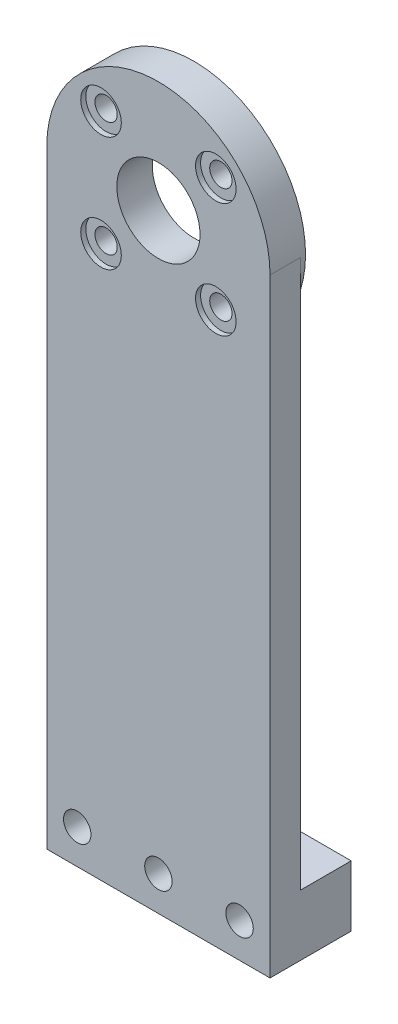
ISO-10303-21;
HEADER;
FILE_DESCRIPTION(('STEP AP214'),'2;1');
FILE_NAME('part.step','',(''),(''),'','','');
FILE_SCHEMA(('AUTOMOTIVE_DESIGN { 1 0 10303 214 1 1 1 1 }'));
ENDSEC;
DATA;
#1=APPLICATION_CONTEXT('core data for automotive mechanical design processes');
#2=APPLICATION_PROTOCOL_DEFINITION('international standard','automotive_design',2000,#1);
#3=PRODUCT_CONTEXT('',#1,'mechanical');
#4=PRODUCT('Part','Part','',(#3));
#5=PRODUCT_RELATED_PRODUCT_CATEGORY('part','',(#4));
#6=PRODUCT_DEFINITION_FORMATION('','',#4);
#7=PRODUCT_DEFINITION_CONTEXT('part definition',#1,'design');
#8=PRODUCT_DEFINITION('design','',#6,#7);
#9=PRODUCT_DEFINITION_SHAPE('','',#8);
#10=(LENGTH_UNIT() NAMED_UNIT(*) SI_UNIT(.MILLI.,.METRE.));
#11=(NAMED_UNIT(*) PLANE_ANGLE_UNIT() SI_UNIT($,.RADIAN.));
#12=(NAMED_UNIT(*) SI_UNIT($,.STERADIAN.) SOLID_ANGLE_UNIT());
#13=UNCERTAINTY_MEASURE_WITH_UNIT(LENGTH_MEASURE(1.E-05),#10,'distance_accuracy_value','');
#14=(GEOMETRIC_REPRESENTATION_CONTEXT(3) GLOBAL_UNCERTAINTY_ASSIGNED_CONTEXT((#13)) GLOBAL_UNIT_ASSIGNED_CONTEXT((#10,
#11,#12)) REPRESENTATION_CONTEXT('',''));
#15=CARTESIAN_POINT('',(0.,0.,0.));
#16=DIRECTION('',(0.,0.,1.));
#17=DIRECTION('',(1.,0.,0.));
#18=AXIS2_PLACEMENT_3D('',#15,#16,#17);
#19=CARTESIAN_POINT('',(-5.65685424949235,24.3431457505076,-12.0965512114594));
#20=DIRECTION('',(0.,0.,1.));
#21=DIRECTION('',(1.,0.,0.));
#22=AXIS2_PLACEMENT_3D('',#19,#20,#21);
#23=CYLINDRICAL_SURFACE('',#22,1.10000000000001);
#24=CARTESIAN_POINT('',(-5.65685424949235,24.3431457505076,-0.5));
#25=DIRECTION('',(0.,0.,1.));
#26=DIRECTION('',(1.,0.,0.));
#27=AXIS2_PLACEMENT_3D('',#24,#25,#26);
#28=CIRCLE('',#27,1.10000000000001);
#29=CARTESIAN_POINT('',(-4.55685424949234,24.3431457505076,-0.5));
#30=VERTEX_POINT('',#29);
#31=EDGE_CURVE('E214',#30,#30,#28,.F.);
#32=ORIENTED_EDGE('',*,*,#31,.T.);
#33=EDGE_LOOP('',(#32));
#34=FACE_BOUND('',#33,.T.);
#35=CARTESIAN_POINT('',(-5.65685424949235,24.3431457505076,2.5));
#36=DIRECTION('',(0.,0.,1.));
#37=DIRECTION('',(1.,0.,0.));
#38=AXIS2_PLACEMENT_3D('',#35,#36,#37);
#39=CIRCLE('',#38,1.10000000000001);
#40=CARTESIAN_POINT('',(-4.55685424949234,24.3431457505076,2.5));
#41=VERTEX_POINT('',#40);
#42=EDGE_CURVE('E196',#41,#41,#39,.F.);
#43=ORIENTED_EDGE('',*,*,#42,.F.);
#44=EDGE_LOOP('',(#43));
#45=FACE_BOUND('',#44,.T.);
#46=ADVANCED_FACE('F73',(#34,#45),#23,.F.);
#47=CARTESIAN_POINT('',(-5.65685424949243,35.6568542494923,-12.0965512114594));
#48=DIRECTION('',(0.,0.,1.));
#49=DIRECTION('',(1.,0.,0.));
#50=AXIS2_PLACEMENT_3D('',#47,#48,#49);
#51=CYLINDRICAL_SURFACE('',#50,1.10000000000001);
#52=CARTESIAN_POINT('',(-5.65685424949243,35.6568542494923,-0.5));
#53=DIRECTION('',(0.,0.,1.));
#54=DIRECTION('',(1.,0.,0.));
#55=AXIS2_PLACEMENT_3D('',#52,#53,#54);
#56=CIRCLE('',#55,1.10000000000001);
#57=CARTESIAN_POINT('',(-4.55685424949242,35.6568542494923,-0.5));
#58=VERTEX_POINT('',#57);
#59=EDGE_CURVE('E218',#58,#58,#56,.F.);
#60=ORIENTED_EDGE('',*,*,#59,.T.);
#61=EDGE_LOOP('',(#60));
#62=FACE_BOUND('',#61,.T.);
#63=CARTESIAN_POINT('',(-5.65685424949243,35.6568542494923,2.5));
#64=DIRECTION('',(0.,0.,1.));
#65=DIRECTION('',(1.,0.,0.));
#66=AXIS2_PLACEMENT_3D('',#63,#64,#65);
#67=CIRCLE('',#66,1.10000000000001);
#68=CARTESIAN_POINT('',(-4.55685424949242,35.6568542494923,2.5));
#69=VERTEX_POINT('',#68);
#70=EDGE_CURVE('E183',#69,#69,#67,.F.);
#71=ORIENTED_EDGE('',*,*,#70,.F.);
#72=EDGE_LOOP('',(#71));
#73=FACE_BOUND('',#72,.T.);
#74=ADVANCED_FACE('F297',(#62,#73),#51,.F.);
#75=CARTESIAN_POINT('',(5.65685424949247,24.3431457505077,-12.0965512114594));
#76=DIRECTION('',(0.,0.,1.));
#77=DIRECTION('',(1.,0.,0.));
#78=AXIS2_PLACEMENT_3D('',#75,#76,#77);
#79=CYLINDRICAL_SURFACE('',#78,1.10000000000001);
#80=CARTESIAN_POINT('',(5.65685424949247,24.3431457505077,-0.5));
#81=DIRECTION('',(0.,0.,1.));
#82=DIRECTION('',(1.,0.,0.));
#83=AXIS2_PLACEMENT_3D('',#80,#81,#82);
#84=CIRCLE('',#83,1.10000000000001);
#85=CARTESIAN_POINT('',(6.75685424949248,24.3431457505077,-0.5));
#86=VERTEX_POINT('',#85);
#87=EDGE_CURVE('E191',#86,#86,#84,.F.);
#88=ORIENTED_EDGE('',*,*,#87,.T.);
#89=EDGE_LOOP('',(#88));
#90=FACE_BOUND('',#89,.T.);
#91=CARTESIAN_POINT('',(5.65685424949247,24.3431457505077,2.5));
#92=DIRECTION('',(0.,0.,1.));
#93=DIRECTION('',(1.,0.,0.));
#94=AXIS2_PLACEMENT_3D('',#91,#92,#93);
#95=CIRCLE('',#94,1.10000000000001);
#96=CARTESIAN_POINT('',(6.75685424949248,24.3431457505077,2.5));
#97=VERTEX_POINT('',#96);
#98=EDGE_CURVE('E175',#97,#97,#95,.F.);
#99=ORIENTED_EDGE('',*,*,#98,.F.);
#100=EDGE_LOOP('',(#99));
#101=FACE_BOUND('',#100,.T.);
#102=ADVANCED_FACE('F303',(#90,#101),#79,.F.);
#103=CARTESIAN_POINT('',(5.65685424949234,35.6568542494924,-12.0965512114594));
#104=DIRECTION('',(0.,0.,1.));
#105=DIRECTION('',(1.,0.,0.));
#106=AXIS2_PLACEMENT_3D('',#103,#104,#105);
#107=CYLINDRICAL_SURFACE('',#106,1.10000000000001);
#108=CARTESIAN_POINT('',(5.65685424949234,35.6568542494924,-0.5));
#109=DIRECTION('',(0.,0.,1.));
#110=DIRECTION('',(1.,0.,0.));
#111=AXIS2_PLACEMENT_3D('',#108,#109,#110);
#112=CIRCLE('',#111,1.10000000000001);
#113=CARTESIAN_POINT('',(6.75685424949235,35.6568542494924,-0.5));
#114=VERTEX_POINT('',#113);
#115=EDGE_CURVE('E237',#114,#114,#112,.F.);
#116=ORIENTED_EDGE('',*,*,#115,.T.);
#117=EDGE_LOOP('',(#116));
#118=FACE_BOUND('',#117,.T.);
#119=CARTESIAN_POINT('',(5.65685424949234,35.6568542494924,2.5));
#120=DIRECTION('',(0.,0.,1.));
#121=DIRECTION('',(1.,0.,0.));
#122=AXIS2_PLACEMENT_3D('',#119,#120,#121);
#123=CIRCLE('',#122,1.10000000000001);
#124=CARTESIAN_POINT('',(6.75685424949235,35.6568542494924,2.5));
#125=VERTEX_POINT('',#124);
#126=EDGE_CURVE('E222',#125,#125,#123,.F.);
#127=ORIENTED_EDGE('',*,*,#126,.F.);
#128=EDGE_LOOP('',(#127));
#129=FACE_BOUND('',#128,.T.);
#130=ADVANCED_FACE('F313',(#118,#129),#107,.F.);
#131=CARTESIAN_POINT('',(11.,0.,3.));
#132=DIRECTION('',(1.,0.,0.));
#133=DIRECTION('',(0.,1.,0.));
#134=AXIS2_PLACEMENT_3D('',#131,#132,#133);
#135=PLANE('',#134);
#136=DIRECTION('',(0.,0.,-1.));
#137=VECTOR('',#136,1.);
#138=CARTESIAN_POINT('',(11.,-30.,3.));
#139=LINE('',#138,#137);
#140=CARTESIAN_POINT('',(11.,-30.,3.));
#141=VERTEX_POINT('',#140);
#142=CARTESIAN_POINT('',(11.,-30.,-5.));
#143=VERTEX_POINT('',#142);
#144=EDGE_CURVE('E134',#141,#143,#139,.T.);
#145=ORIENTED_EDGE('',*,*,#144,.T.);
#146=DIRECTION('',(0.,-1.,0.));
#147=VECTOR('',#146,1.);
#148=CARTESIAN_POINT('',(11.,0.,-5.));
#149=LINE('',#148,#147);
#150=CARTESIAN_POINT('',(11.,-24.,-5.));
#151=VERTEX_POINT('',#150);
#152=EDGE_CURVE('E136',#151,#143,#149,.T.);
#153=ORIENTED_EDGE('',*,*,#152,.F.);
#154=DIRECTION('',(0.,0.,1.));
#155=VECTOR('',#154,1.);
#156=CARTESIAN_POINT('',(11.,-24.,-5.));
#157=LINE('',#156,#155);
#158=CARTESIAN_POINT('',(11.,-24.,0.));
#159=VERTEX_POINT('',#158);
#160=EDGE_CURVE('E170',#151,#159,#157,.T.);
#161=ORIENTED_EDGE('',*,*,#160,.T.);
#162=DIRECTION('',(0.,-1.,0.));
#163=VECTOR('',#162,1.);
#164=CARTESIAN_POINT('',(11.,0.,0.));
#165=LINE('',#164,#163);
#166=CARTESIAN_POINT('',(11.,30.,0.));
#167=VERTEX_POINT('',#166);
#168=EDGE_CURVE('E263',#167,#159,#165,.T.);
#169=ORIENTED_EDGE('',*,*,#168,.F.);
#170=DIRECTION('',(0.,0.,-1.));
#171=VECTOR('',#170,1.);
#172=CARTESIAN_POINT('',(11.,30.,3.));
#173=LINE('',#172,#171);
#174=CARTESIAN_POINT('',(11.,30.,3.));
#175=VERTEX_POINT('',#174);
#176=EDGE_CURVE('E84',#175,#167,#173,.T.);
#177=ORIENTED_EDGE('',*,*,#176,.F.);
#178=DIRECTION('',(0.,-1.,0.));
#179=VECTOR('',#178,1.);
#180=CARTESIAN_POINT('',(11.,0.,3.));
#181=LINE('',#180,#179);
#182=EDGE_CURVE('E93',#175,#141,#181,.T.);
#183=ORIENTED_EDGE('',*,*,#182,.T.);
#184=EDGE_LOOP('',(#145,#153,#161,#169,#177,#183));
#185=FACE_BOUND('',#184,.T.);
#186=ADVANCED_FACE('F75',(#185),#135,.T.);
#187=CARTESIAN_POINT('',(0.,0.,0.));
#188=DIRECTION('',(0.,0.,1.));
#189=DIRECTION('',(1.,0.,0.));
#190=AXIS2_PLACEMENT_3D('',#187,#188,#189);
#191=PLANE('',#190);
#192=ORIENTED_EDGE('',*,*,#168,.T.);
#193=DIRECTION('',(-1.,0.,0.));
#194=VECTOR('',#193,1.);
#195=CARTESIAN_POINT('',(0.,-24.,0.));
#196=LINE('',#195,#194);
#197=CARTESIAN_POINT('',(-11.,-24.,0.));
#198=VERTEX_POINT('',#197);
#199=EDGE_CURVE('E157',#159,#198,#196,.T.);
#200=ORIENTED_EDGE('',*,*,#199,.T.);
#201=DIRECTION('',(0.,-1.,0.));
#202=VECTOR('',#201,1.);
#203=CARTESIAN_POINT('',(-11.,0.,0.));
#204=LINE('',#203,#202);
#205=CARTESIAN_POINT('',(-11.,30.,0.));
#206=VERTEX_POINT('',#205);
#207=EDGE_CURVE('E256',#206,#198,#204,.T.);
#208=ORIENTED_EDGE('',*,*,#207,.F.);
#209=CARTESIAN_POINT('',(0.,30.,0.));
#210=DIRECTION('',(0.,0.,1.));
#211=DIRECTION('',(1.,0.,0.));
#212=AXIS2_PLACEMENT_3D('',#209,#210,#211);
#213=CIRCLE('',#212,11.);
#214=EDGE_CURVE('E13',#206,#167,#213,.T.);
#215=ORIENTED_EDGE('',*,*,#214,.T.);
#216=EDGE_LOOP('',(#192,#200,#208,#215));
#217=FACE_BOUND('',#216,.T.);
#218=ADVANCED_FACE('F276',(#217),#191,.F.);
#219=CARTESIAN_POINT('',(0.,-30.,3.));
#220=DIRECTION('',(0.,1.,0.));
#221=DIRECTION('',(-1.,0.,0.));
#222=AXIS2_PLACEMENT_3D('',#219,#220,#221);
#223=PLANE('',#222);
#224=DIRECTION('',(0.,0.,-1.));
#225=VECTOR('',#224,1.);
#226=CARTESIAN_POINT('',(-11.,-30.,3.));
#227=LINE('',#226,#225);
#228=CARTESIAN_POINT('',(-11.,-30.,3.));
#229=VERTEX_POINT('',#228);
#230=CARTESIAN_POINT('',(-11.,-30.,-5.));
#231=VERTEX_POINT('',#230);
#232=EDGE_CURVE('E77',#229,#231,#227,.T.);
#233=ORIENTED_EDGE('',*,*,#232,.T.);
#234=DIRECTION('',(1.,0.,0.));
#235=VECTOR('',#234,1.);
#236=CARTESIAN_POINT('',(0.,-30.,-5.));
#237=LINE('',#236,#235);
#238=EDGE_CURVE('E148',#231,#143,#237,.T.);
#239=ORIENTED_EDGE('',*,*,#238,.T.);
#240=ORIENTED_EDGE('',*,*,#144,.F.);
#241=DIRECTION('',(1.,0.,0.));
#242=VECTOR('',#241,1.);
#243=CARTESIAN_POINT('',(0.,-30.,3.));
#244=LINE('',#243,#242);
#245=EDGE_CURVE('E142',#229,#141,#244,.T.);
#246=ORIENTED_EDGE('',*,*,#245,.F.);
#247=EDGE_LOOP('',(#233,#239,#240,#246));
#248=FACE_BOUND('',#247,.T.);
#249=ADVANCED_FACE('F154',(#248),#223,.F.);
#250=CARTESIAN_POINT('',(0.,0.,3.));
#251=DIRECTION('',(0.,0.,1.));
#252=DIRECTION('',(1.,0.,0.));
#253=AXIS2_PLACEMENT_3D('',#250,#251,#252);
#254=PLANE('',#253);
#255=CARTESIAN_POINT('',(8.,-26.6,3.));
#256=DIRECTION('',(0.,0.,1.));
#257=DIRECTION('',(1.,0.,0.));
#258=AXIS2_PLACEMENT_3D('',#255,#256,#257);
#259=CIRCLE('',#258,1.35);
#260=CARTESIAN_POINT('',(9.35,-26.6,3.));
#261=VERTEX_POINT('',#260);
#262=EDGE_CURVE('E496',#261,#261,#259,.T.);
#263=ORIENTED_EDGE('',*,*,#262,.F.);
#264=EDGE_LOOP('',(#263));
#265=FACE_BOUND('',#264,.T.);
#266=CARTESIAN_POINT('',(-8.,-26.6,3.));
#267=DIRECTION('',(0.,0.,1.));
#268=DIRECTION('',(1.,0.,0.));
#269=AXIS2_PLACEMENT_3D('',#266,#267,#268);
#270=CIRCLE('',#269,1.35);
#271=CARTESIAN_POINT('',(-6.65,-26.6,3.));
#272=VERTEX_POINT('',#271);
#273=EDGE_CURVE('E503',#272,#272,#270,.T.);
#274=ORIENTED_EDGE('',*,*,#273,.F.);
#275=EDGE_LOOP('',(#274));
#276=FACE_BOUND('',#275,.T.);
#277=CARTESIAN_POINT('',(0.,-26.6,3.));
#278=DIRECTION('',(0.,0.,1.));
#279=DIRECTION('',(1.,0.,0.));
#280=AXIS2_PLACEMENT_3D('',#277,#278,#279);
#281=CIRCLE('',#280,1.35);
#282=CARTESIAN_POINT('',(1.35,-26.6,3.));
#283=VERTEX_POINT('',#282);
#284=EDGE_CURVE('E498',#283,#283,#281,.T.);
#285=ORIENTED_EDGE('',*,*,#284,.F.);
#286=EDGE_LOOP('',(#285));
#287=FACE_BOUND('',#286,.T.);
#288=CARTESIAN_POINT('',(-5.65685424949243,35.6568542494923,3.));
#289=DIRECTION('',(0.,0.,1.));
#290=DIRECTION('',(0.,1.,0.));
#291=AXIS2_PLACEMENT_3D('',#288,#289,#290);
#292=CIRCLE('',#291,2.00000000000001);
#293=CARTESIAN_POINT('',(-5.65685424949244,37.6568542494923,3.));
#294=VERTEX_POINT('',#293);
#295=EDGE_CURVE('E178',#294,#294,#292,.T.);
#296=ORIENTED_EDGE('',*,*,#295,.F.);
#297=EDGE_LOOP('',(#296));
#298=FACE_BOUND('',#297,.T.);
#299=CARTESIAN_POINT('',(-5.65685424949235,24.3431457505076,3.));
#300=DIRECTION('',(0.,0.,1.));
#301=DIRECTION('',(-1.,0.,0.));
#302=AXIS2_PLACEMENT_3D('',#299,#300,#301);
#303=CIRCLE('',#302,2.00000000000001);
#304=CARTESIAN_POINT('',(-7.65685424949236,24.3431457505076,3.));
#305=VERTEX_POINT('',#304);
#306=EDGE_CURVE('E192',#305,#305,#303,.T.);
#307=ORIENTED_EDGE('',*,*,#306,.F.);
#308=EDGE_LOOP('',(#307));
#309=FACE_BOUND('',#308,.T.);
#310=CARTESIAN_POINT('',(5.65685424949247,24.3431457505077,3.));
#311=DIRECTION('',(0.,0.,1.));
#312=DIRECTION('',(0.,-1.,0.));
#313=AXIS2_PLACEMENT_3D('',#310,#311,#312);
#314=CIRCLE('',#313,2.00000000000001);
#315=CARTESIAN_POINT('',(5.65685424949249,22.3431457505077,3.));
#316=VERTEX_POINT('',#315);
#317=EDGE_CURVE('E204',#316,#316,#314,.T.);
#318=ORIENTED_EDGE('',*,*,#317,.F.);
#319=EDGE_LOOP('',(#318));
#320=FACE_BOUND('',#319,.T.);
#321=CARTESIAN_POINT('',(5.65685424949234,35.6568542494924,3.));
#322=DIRECTION('',(0.,0.,1.));
#323=DIRECTION('',(1.,0.,0.));
#324=AXIS2_PLACEMENT_3D('',#321,#322,#323);
#325=CIRCLE('',#324,2.00000000000001);
#326=CARTESIAN_POINT('',(7.65685424949235,35.6568542494924,3.));
#327=VERTEX_POINT('',#326);
#328=EDGE_CURVE('E226',#327,#327,#325,.T.);
#329=ORIENTED_EDGE('',*,*,#328,.F.);
#330=EDGE_LOOP('',(#329));
#331=FACE_BOUND('',#330,.T.);
#332=CARTESIAN_POINT('',(0.,30.,3.));
#333=DIRECTION('',(0.,0.,1.));
#334=DIRECTION('',(1.,0.,0.));
#335=AXIS2_PLACEMENT_3D('',#332,#333,#334);
#336=CIRCLE('',#335,4.1);
#337=CARTESIAN_POINT('',(4.1,30.,3.));
#338=VERTEX_POINT('',#337);
#339=EDGE_CURVE('E238',#338,#338,#336,.T.);
#340=ORIENTED_EDGE('',*,*,#339,.F.);
#341=EDGE_LOOP('',(#340));
#342=FACE_BOUND('',#341,.T.);
#343=DIRECTION('',(0.,-1.,0.));
#344=VECTOR('',#343,1.);
#345=CARTESIAN_POINT('',(-11.,0.,3.));
#346=LINE('',#345,#344);
#347=CARTESIAN_POINT('',(-11.,30.,3.));
#348=VERTEX_POINT('',#347);
#349=EDGE_CURVE('E109',#348,#229,#346,.T.);
#350=ORIENTED_EDGE('',*,*,#349,.T.);
#351=ORIENTED_EDGE('',*,*,#245,.T.);
#352=ORIENTED_EDGE('',*,*,#182,.F.);
#353=CARTESIAN_POINT('',(0.,30.,3.));
#354=DIRECTION('',(0.,0.,1.));
#355=DIRECTION('',(1.,0.,0.));
#356=AXIS2_PLACEMENT_3D('',#353,#354,#355);
#357=CIRCLE('',#356,11.);
#358=EDGE_CURVE('E255',#175,#348,#357,.T.);
#359=ORIENTED_EDGE('',*,*,#358,.T.);
#360=EDGE_LOOP('',(#350,#351,#352,#359));
#361=FACE_BOUND('',#360,.T.);
#362=ADVANCED_FACE('F335',(#265,#276,#287,#298,#309,#320,#331,#342,#361),#254,.T.);
#363=CARTESIAN_POINT('',(0.,30.,3.));
#364=DIRECTION('',(0.,0.,-1.));
#365=DIRECTION('',(-1.,0.,0.));
#366=AXIS2_PLACEMENT_3D('',#363,#364,#365);
#367=CYLINDRICAL_SURFACE('',#366,11.);
#368=ORIENTED_EDGE('',*,*,#176,.T.);
#369=ORIENTED_EDGE('',*,*,#214,.F.);
#370=DIRECTION('',(0.,0.,-1.));
#371=VECTOR('',#370,1.);
#372=CARTESIAN_POINT('',(-11.,30.,3.));
#373=LINE('',#372,#371);
#374=EDGE_CURVE('E141',#348,#206,#373,.T.);
#375=ORIENTED_EDGE('',*,*,#374,.F.);
#376=ORIENTED_EDGE('',*,*,#358,.F.);
#377=EDGE_LOOP('',(#368,#369,#375,#376));
#378=FACE_BOUND('',#377,.T.);
#379=CARTESIAN_POINT('',(0.,30.,-0.5));
#380=DIRECTION('',(0.,0.,1.));
#381=DIRECTION('',(1.,0.,0.));
#382=AXIS2_PLACEMENT_3D('',#379,#380,#381);
#383=CIRCLE('',#382,11.);
#384=CARTESIAN_POINT('',(11.,30.,-0.5));
#385=VERTEX_POINT('',#384);
#386=EDGE_CURVE('E246',#385,#385,#383,.T.);
#387=ORIENTED_EDGE('',*,*,#386,.T.);
#388=EDGE_LOOP('',(#387));
#389=FACE_BOUND('',#388,.T.);
#390=ADVANCED_FACE('F273',(#378,#389),#367,.T.);
#391=CARTESIAN_POINT('',(-11.,0.,3.));
#392=DIRECTION('',(1.,0.,0.));
#393=DIRECTION('',(0.,1.,0.));
#394=AXIS2_PLACEMENT_3D('',#391,#392,#393);
#395=PLANE('',#394);
#396=ORIENTED_EDGE('',*,*,#207,.T.);
#397=DIRECTION('',(0.,0.,1.));
#398=VECTOR('',#397,1.);
#399=CARTESIAN_POINT('',(-11.,-24.,-5.));
#400=LINE('',#399,#398);
#401=CARTESIAN_POINT('',(-11.,-24.,-5.));
#402=VERTEX_POINT('',#401);
#403=EDGE_CURVE('E172',#402,#198,#400,.T.);
#404=ORIENTED_EDGE('',*,*,#403,.F.);
#405=DIRECTION('',(0.,-1.,0.));
#406=VECTOR('',#405,1.);
#407=CARTESIAN_POINT('',(-11.,0.,-5.));
#408=LINE('',#407,#406);
#409=EDGE_CURVE('E168',#402,#231,#408,.T.);
#410=ORIENTED_EDGE('',*,*,#409,.T.);
#411=ORIENTED_EDGE('',*,*,#232,.F.);
#412=ORIENTED_EDGE('',*,*,#349,.F.);
#413=ORIENTED_EDGE('',*,*,#374,.T.);
#414=EDGE_LOOP('',(#396,#404,#410,#411,#412,#413));
#415=FACE_BOUND('',#414,.T.);
#416=ADVANCED_FACE('F279',(#415),#395,.F.);
#417=CARTESIAN_POINT('',(0.,0.,-0.5));
#418=DIRECTION('',(0.,0.,1.));
#419=DIRECTION('',(1.,0.,0.));
#420=AXIS2_PLACEMENT_3D('',#417,#418,#419);
#421=PLANE('',#420);
#422=ORIENTED_EDGE('',*,*,#87,.F.);
#423=EDGE_LOOP('',(#422));
#424=FACE_BOUND('',#423,.T.);
#425=ORIENTED_EDGE('',*,*,#59,.F.);
#426=EDGE_LOOP('',(#425));
#427=FACE_BOUND('',#426,.T.);
#428=ORIENTED_EDGE('',*,*,#31,.F.);
#429=EDGE_LOOP('',(#428));
#430=FACE_BOUND('',#429,.T.);
#431=CARTESIAN_POINT('',(0.,30.,-0.5));
#432=DIRECTION('',(0.,0.,1.));
#433=DIRECTION('',(1.,0.,0.));
#434=AXIS2_PLACEMENT_3D('',#431,#432,#433);
#435=CIRCLE('',#434,4.1);
#436=CARTESIAN_POINT('',(4.1,30.,-0.5));
#437=VERTEX_POINT('',#436);
#438=EDGE_CURVE('E242',#437,#437,#435,.F.);
#439=ORIENTED_EDGE('',*,*,#438,.F.);
#440=EDGE_LOOP('',(#439));
#441=FACE_BOUND('',#440,.T.);
#442=ORIENTED_EDGE('',*,*,#115,.F.);
#443=EDGE_LOOP('',(#442));
#444=FACE_BOUND('',#443,.T.);
#445=ORIENTED_EDGE('',*,*,#386,.F.);
#446=EDGE_LOOP('',(#445));
#447=FACE_BOUND('',#446,.T.);
#448=ADVANCED_FACE('F327',(#424,#427,#430,#441,#444,#447),#421,.F.);
#449=CARTESIAN_POINT('',(0.,30.,-12.0965512114594));
#450=DIRECTION('',(0.,0.,1.));
#451=DIRECTION('',(1.,0.,0.));
#452=AXIS2_PLACEMENT_3D('',#449,#450,#451);
#453=CYLINDRICAL_SURFACE('',#452,4.1);
#454=ORIENTED_EDGE('',*,*,#438,.T.);
#455=EDGE_LOOP('',(#454));
#456=FACE_BOUND('',#455,.T.);
#457=ORIENTED_EDGE('',*,*,#339,.T.);
#458=EDGE_LOOP('',(#457));
#459=FACE_BOUND('',#458,.T.);
#460=ADVANCED_FACE('F319',(#456,#459),#453,.F.);
#461=CARTESIAN_POINT('',(5.65685424949234,35.6568542494924,-6.1568542494924));
#462=DIRECTION('',(0.,0.,1.));
#463=DIRECTION('',(1.,0.,0.));
#464=AXIS2_PLACEMENT_3D('',#461,#462,#463);
#465=CYLINDRICAL_SURFACE('',#464,2.00000000000001);
#466=CARTESIAN_POINT('',(5.65685424949234,35.6568542494924,2.5));
#467=DIRECTION('',(0.,0.,1.));
#468=DIRECTION('',(1.,0.,0.));
#469=AXIS2_PLACEMENT_3D('',#466,#467,#468);
#470=CIRCLE('',#469,2.00000000000001);
#471=CARTESIAN_POINT('',(7.65685424949235,35.6568542494924,2.5));
#472=VERTEX_POINT('',#471);
#473=EDGE_CURVE('E230',#472,#472,#470,.F.);
#474=ORIENTED_EDGE('',*,*,#473,.T.);
#475=EDGE_LOOP('',(#474));
#476=FACE_BOUND('',#475,.T.);
#477=ORIENTED_EDGE('',*,*,#328,.T.);
#478=EDGE_LOOP('',(#477));
#479=FACE_BOUND('',#478,.T.);
#480=ADVANCED_FACE('F315',(#476,#479),#465,.F.);
#481=CARTESIAN_POINT('',(0.,0.,2.5));
#482=DIRECTION('',(0.,0.,1.));
#483=DIRECTION('',(1.,0.,0.));
#484=AXIS2_PLACEMENT_3D('',#481,#482,#483);
#485=PLANE('',#484);
#486=ORIENTED_EDGE('',*,*,#473,.F.);
#487=EDGE_LOOP('',(#486));
#488=FACE_BOUND('',#487,.T.);
#489=ORIENTED_EDGE('',*,*,#126,.T.);
#490=EDGE_LOOP('',(#489));
#491=FACE_BOUND('',#490,.T.);
#492=ADVANCED_FACE('F318',(#488,#491),#485,.T.);
#493=CARTESIAN_POINT('',(5.65685424949247,24.3431457505077,-6.1568542494924));
#494=DIRECTION('',(0.,0.,1.));
#495=DIRECTION('',(1.,0.,0.));
#496=AXIS2_PLACEMENT_3D('',#493,#494,#495);
#497=CYLINDRICAL_SURFACE('',#496,2.00000000000001);
#498=CARTESIAN_POINT('',(5.65685424949247,24.3431457505077,2.5));
#499=DIRECTION('',(0.,0.,1.));
#500=DIRECTION('',(1.,0.,0.));
#501=AXIS2_PLACEMENT_3D('',#498,#499,#500);
#502=CIRCLE('',#501,2.00000000000001);
#503=CARTESIAN_POINT('',(7.65685424949247,24.3431457505077,2.5));
#504=VERTEX_POINT('',#503);
#505=EDGE_CURVE('E200',#504,#504,#502,.F.);
#506=ORIENTED_EDGE('',*,*,#505,.T.);
#507=EDGE_LOOP('',(#506));
#508=FACE_BOUND('',#507,.T.);
#509=ORIENTED_EDGE('',*,*,#317,.T.);
#510=EDGE_LOOP('',(#509));
#511=FACE_BOUND('',#510,.T.);
#512=ADVANCED_FACE('F323',(#508,#511),#497,.F.);
#513=CARTESIAN_POINT('',(0.,0.,2.5));
#514=DIRECTION('',(0.,0.,1.));
#515=DIRECTION('',(1.,0.,0.));
#516=AXIS2_PLACEMENT_3D('',#513,#514,#515);
#517=PLANE('',#516);
#518=ORIENTED_EDGE('',*,*,#505,.F.);
#519=EDGE_LOOP('',(#518));
#520=FACE_BOUND('',#519,.T.);
#521=ORIENTED_EDGE('',*,*,#98,.T.);
#522=EDGE_LOOP('',(#521));
#523=FACE_BOUND('',#522,.T.);
#524=ADVANCED_FACE('F308',(#520,#523),#517,.T.);
#525=CARTESIAN_POINT('',(-5.65685424949243,35.6568542494923,-6.1568542494924));
#526=DIRECTION('',(0.,0.,1.));
#527=DIRECTION('',(1.,0.,0.));
#528=AXIS2_PLACEMENT_3D('',#525,#526,#527);
#529=CYLINDRICAL_SURFACE('',#528,2.00000000000001);
#530=CARTESIAN_POINT('',(-5.65685424949243,35.6568542494923,2.5));
#531=DIRECTION('',(0.,0.,1.));
#532=DIRECTION('',(1.,0.,0.));
#533=AXIS2_PLACEMENT_3D('',#530,#531,#532);
#534=CIRCLE('',#533,2.00000000000001);
#535=CARTESIAN_POINT('',(-3.65685424949243,35.6568542494923,2.5));
#536=VERTEX_POINT('',#535);
#537=EDGE_CURVE('E182',#536,#536,#534,.F.);
#538=ORIENTED_EDGE('',*,*,#537,.T.);
#539=EDGE_LOOP('',(#538));
#540=FACE_BOUND('',#539,.T.);
#541=ORIENTED_EDGE('',*,*,#295,.T.);
#542=EDGE_LOOP('',(#541));
#543=FACE_BOUND('',#542,.T.);
#544=ADVANCED_FACE('F384',(#540,#543),#529,.F.);
#545=CARTESIAN_POINT('',(0.,0.,2.5));
#546=DIRECTION('',(0.,0.,1.));
#547=DIRECTION('',(1.,0.,0.));
#548=AXIS2_PLACEMENT_3D('',#545,#546,#547);
#549=PLANE('',#548);
#550=ORIENTED_EDGE('',*,*,#537,.F.);
#551=EDGE_LOOP('',(#550));
#552=FACE_BOUND('',#551,.T.);
#553=ORIENTED_EDGE('',*,*,#70,.T.);
#554=EDGE_LOOP('',(#553));
#555=FACE_BOUND('',#554,.T.);
#556=ADVANCED_FACE('F391',(#552,#555),#549,.T.);
#557=CARTESIAN_POINT('',(-5.65685424949235,24.3431457505076,-6.1568542494924));
#558=DIRECTION('',(0.,0.,1.));
#559=DIRECTION('',(1.,0.,0.));
#560=AXIS2_PLACEMENT_3D('',#557,#558,#559);
#561=CYLINDRICAL_SURFACE('',#560,2.00000000000001);
#562=CARTESIAN_POINT('',(-5.65685424949235,24.3431457505076,2.5));
#563=DIRECTION('',(0.,0.,1.));
#564=DIRECTION('',(1.,0.,0.));
#565=AXIS2_PLACEMENT_3D('',#562,#563,#564);
#566=CIRCLE('',#565,2.00000000000001);
#567=CARTESIAN_POINT('',(-3.65685424949234,24.3431457505076,2.5));
#568=VERTEX_POINT('',#567);
#569=EDGE_CURVE('E187',#568,#568,#566,.F.);
#570=ORIENTED_EDGE('',*,*,#569,.T.);
#571=EDGE_LOOP('',(#570));
#572=FACE_BOUND('',#571,.T.);
#573=ORIENTED_EDGE('',*,*,#306,.T.);
#574=EDGE_LOOP('',(#573));
#575=FACE_BOUND('',#574,.T.);
#576=ADVANCED_FACE('F292',(#572,#575),#561,.F.);
#577=CARTESIAN_POINT('',(0.,0.,2.5));
#578=DIRECTION('',(0.,0.,1.));
#579=DIRECTION('',(1.,0.,0.));
#580=AXIS2_PLACEMENT_3D('',#577,#578,#579);
#581=PLANE('',#580);
#582=ORIENTED_EDGE('',*,*,#569,.F.);
#583=EDGE_LOOP('',(#582));
#584=FACE_BOUND('',#583,.T.);
#585=ORIENTED_EDGE('',*,*,#42,.T.);
#586=EDGE_LOOP('',(#585));
#587=FACE_BOUND('',#586,.T.);
#588=ADVANCED_FACE('F283',(#584,#587),#581,.T.);
#589=CARTESIAN_POINT('',(0.,-24.,-5.));
#590=DIRECTION('',(0.,1.,0.));
#591=DIRECTION('',(0.,0.,1.));
#592=AXIS2_PLACEMENT_3D('',#589,#590,#591);
#593=PLANE('',#592);
#594=ORIENTED_EDGE('',*,*,#199,.F.);
#595=ORIENTED_EDGE('',*,*,#160,.F.);
#596=DIRECTION('',(-1.,0.,0.));
#597=VECTOR('',#596,1.);
#598=CARTESIAN_POINT('',(0.,-24.,-5.));
#599=LINE('',#598,#597);
#600=EDGE_CURVE('E151',#151,#402,#599,.T.);
#601=ORIENTED_EDGE('',*,*,#600,.T.);
#602=ORIENTED_EDGE('',*,*,#403,.T.);
#603=EDGE_LOOP('',(#594,#595,#601,#602));
#604=FACE_BOUND('',#603,.T.);
#605=ADVANCED_FACE('F281',(#604),#593,.T.);
#606=CARTESIAN_POINT('',(0.,0.,-5.));
#607=DIRECTION('',(0.,0.,1.));
#608=DIRECTION('',(1.,0.,0.));
#609=AXIS2_PLACEMENT_3D('',#606,#607,#608);
#610=PLANE('',#609);
#611=CARTESIAN_POINT('',(8.,-26.6,-5.));
#612=DIRECTION('',(0.,0.,1.));
#613=DIRECTION('',(1.,0.,0.));
#614=AXIS2_PLACEMENT_3D('',#611,#612,#613);
#615=CIRCLE('',#614,1.35);
#616=CARTESIAN_POINT('',(9.35,-26.6,-5.));
#617=VERTEX_POINT('',#616);
#618=EDGE_CURVE('E493',#617,#617,#615,.F.);
#619=ORIENTED_EDGE('',*,*,#618,.F.);
#620=EDGE_LOOP('',(#619));
#621=FACE_BOUND('',#620,.T.);
#622=CARTESIAN_POINT('',(-8.,-26.6,-5.));
#623=DIRECTION('',(0.,0.,1.));
#624=DIRECTION('',(1.,0.,0.));
#625=AXIS2_PLACEMENT_3D('',#622,#623,#624);
#626=CIRCLE('',#625,1.35);
#627=CARTESIAN_POINT('',(-6.65,-26.6,-5.));
#628=VERTEX_POINT('',#627);
#629=EDGE_CURVE('E506',#628,#628,#626,.F.);
#630=ORIENTED_EDGE('',*,*,#629,.F.);
#631=EDGE_LOOP('',(#630));
#632=FACE_BOUND('',#631,.T.);
#633=CARTESIAN_POINT('',(0.,-26.6,-5.));
#634=DIRECTION('',(0.,0.,1.));
#635=DIRECTION('',(1.,0.,0.));
#636=AXIS2_PLACEMENT_3D('',#633,#634,#635);
#637=CIRCLE('',#636,1.35);
#638=CARTESIAN_POINT('',(1.35,-26.6,-5.));
#639=VERTEX_POINT('',#638);
#640=EDGE_CURVE('E161',#639,#639,#637,.F.);
#641=ORIENTED_EDGE('',*,*,#640,.F.);
#642=EDGE_LOOP('',(#641));
#643=FACE_BOUND('',#642,.T.);
#644=ORIENTED_EDGE('',*,*,#238,.F.);
#645=ORIENTED_EDGE('',*,*,#409,.F.);
#646=ORIENTED_EDGE('',*,*,#600,.F.);
#647=ORIENTED_EDGE('',*,*,#152,.T.);
#648=EDGE_LOOP('',(#644,#645,#646,#647));
#649=FACE_BOUND('',#648,.T.);
#650=ADVANCED_FACE('F146',(#621,#632,#643,#649),#610,.F.);
#651=CARTESIAN_POINT('',(0.,-26.6,-8.81837661840736));
#652=DIRECTION('',(0.,0.,1.));
#653=DIRECTION('',(1.,0.,0.));
#654=AXIS2_PLACEMENT_3D('',#651,#652,#653);
#655=CYLINDRICAL_SURFACE('',#654,1.35);
#656=CARTESIAN_POINT('',(1.35,-26.6,-5.));
#657=CARTESIAN_POINT('',(1.35,-26.6,-4.91666666666667));
#658=CARTESIAN_POINT('',(1.35,-26.6,-4.83333333333333));
#659=CARTESIAN_POINT('',(1.35,-26.6,-4.66666666666667));
#660=CARTESIAN_POINT('',(1.35,-26.6,-4.58333333333333));
#661=CARTESIAN_POINT('',(1.35,-26.6,-4.41666666666667));
#662=CARTESIAN_POINT('',(1.35,-26.6,-4.33333333333333));
#663=CARTESIAN_POINT('',(1.35,-26.6,-4.16666666666667));
#664=CARTESIAN_POINT('',(1.35,-26.6,-4.08333333333333));
#665=CARTESIAN_POINT('',(1.35,-26.6,-3.91666666666667));
#666=CARTESIAN_POINT('',(1.35,-26.6,-3.83333333333333));
#667=CARTESIAN_POINT('',(1.35,-26.6,-3.66666666666667));
#668=CARTESIAN_POINT('',(1.35,-26.6,-3.58333333333333));
#669=CARTESIAN_POINT('',(1.35,-26.6,-3.41666666666667));
#670=CARTESIAN_POINT('',(1.35,-26.6,-3.33333333333333));
#671=CARTESIAN_POINT('',(1.35,-26.6,-3.16666666666667));
#672=CARTESIAN_POINT('',(1.35,-26.6,-3.08333333333333));
#673=CARTESIAN_POINT('',(1.35,-26.6,-2.91666666666667));
#674=CARTESIAN_POINT('',(1.35,-26.6,-2.83333333333333));
#675=CARTESIAN_POINT('',(1.35,-26.6,-2.66666666666667));
#676=CARTESIAN_POINT('',(1.35,-26.6,-2.58333333333333));
#677=CARTESIAN_POINT('',(1.35,-26.6,-2.41666666666667));
#678=CARTESIAN_POINT('',(1.35,-26.6,-2.33333333333333));
#679=CARTESIAN_POINT('',(1.35,-26.6,-2.16666666666667));
#680=CARTESIAN_POINT('',(1.35,-26.6,-2.08333333333333));
#681=CARTESIAN_POINT('',(1.35,-26.6,-1.91666666666667));
#682=CARTESIAN_POINT('',(1.35,-26.6,-1.83333333333333));
#683=CARTESIAN_POINT('',(1.35,-26.6,-1.66666666666667));
#684=CARTESIAN_POINT('',(1.35,-26.6,-1.58333333333333));
#685=CARTESIAN_POINT('',(1.35,-26.6,-1.41666666666667));
#686=CARTESIAN_POINT('',(1.35,-26.6,-1.33333333333333));
#687=CARTESIAN_POINT('',(1.35,-26.6,-1.16666666666667));
#688=CARTESIAN_POINT('',(1.35,-26.6,-1.08333333333333));
#689=CARTESIAN_POINT('',(1.35,-26.6,-0.916666666666666));
#690=CARTESIAN_POINT('',(1.35,-26.6,-0.833333333333332));
#691=CARTESIAN_POINT('',(1.35,-26.6,-0.666666666666666));
#692=CARTESIAN_POINT('',(1.35,-26.6,-0.583333333333332));
#693=CARTESIAN_POINT('',(1.35,-26.6,-0.416666666666665));
#694=CARTESIAN_POINT('',(1.35,-26.6,-0.333333333333332));
#695=CARTESIAN_POINT('',(1.35,-26.6,-0.166666666666665));
#696=CARTESIAN_POINT('',(1.35,-26.6,-0.0833333333333317));
#697=CARTESIAN_POINT('',(1.35,-26.6,0.0833333333333345));
#698=CARTESIAN_POINT('',(1.35,-26.6,0.166666666666667));
#699=CARTESIAN_POINT('',(1.35,-26.6,0.333333333333334));
#700=CARTESIAN_POINT('',(1.35,-26.6,0.416666666666667));
#701=CARTESIAN_POINT('',(1.35,-26.6,0.583333333333334));
#702=CARTESIAN_POINT('',(1.35,-26.6,0.666666666666667));
#703=CARTESIAN_POINT('',(1.35,-26.6,0.833333333333334));
#704=CARTESIAN_POINT('',(1.35,-26.6,0.916666666666668));
#705=CARTESIAN_POINT('',(1.35,-26.6,1.08333333333333));
#706=CARTESIAN_POINT('',(1.35,-26.6,1.16666666666667));
#707=CARTESIAN_POINT('',(1.35,-26.6,1.33333333333333));
#708=CARTESIAN_POINT('',(1.35,-26.6,1.41666666666667));
#709=CARTESIAN_POINT('',(1.35,-26.6,1.58333333333333));
#710=CARTESIAN_POINT('',(1.35,-26.6,1.66666666666667));
#711=CARTESIAN_POINT('',(1.35,-26.6,1.83333333333333));
#712=CARTESIAN_POINT('',(1.35,-26.6,1.91666666666667));
#713=CARTESIAN_POINT('',(1.35,-26.6,2.08333333333333));
#714=CARTESIAN_POINT('',(1.35,-26.6,2.16666666666667));
#715=CARTESIAN_POINT('',(1.35,-26.6,2.33333333333333));
#716=CARTESIAN_POINT('',(1.35,-26.6,2.41666666666667));
#717=CARTESIAN_POINT('',(1.35,-26.6,2.58333333333333));
#718=CARTESIAN_POINT('',(1.35,-26.6,2.66666666666667));
#719=CARTESIAN_POINT('',(1.35,-26.6,2.83333333333333));
#720=CARTESIAN_POINT('',(1.35,-26.6,2.91666666666667));
#721=CARTESIAN_POINT('',(1.35,-26.6,3.));
#722=B_SPLINE_CURVE_WITH_KNOTS('',3,(#656,#657,#658,#659,#660,#661,#662,#663,#664,#665,#666,
#667,#668,#669,#670,#671,#672,#673,#674,#675,#676,#677,#678,#679,#680,#681,#682,#683,#684,#685,
#686,#687,#688,#689,#690,#691,#692,#693,#694,#695,#696,#697,#698,#699,#700,#701,#702,#703,#704,
#705,#706,#707,#708,#709,#710,#711,#712,#713,#714,#715,#716,#717,#718,#719,#720,#721),
.UNSPECIFIED.,.F.,.F.,(4,2,2,2,2,2,2,2,2,2,2,2,2,2,2,2,2,2,2,2,2,2,2,2,2,2,2,2,2,2,2,2,4),(0.,
0.25,0.5,0.750000000000001,1.,1.25,1.5,1.75,2.,2.25,2.5,2.75,3.,3.25,3.5,3.75,4.,4.25,4.5,4.75,
5.,5.25,5.5,5.75,6.,6.25,6.5,6.75,7.,7.25,7.5,7.75,8.),.UNSPECIFIED.);
#723=EDGE_CURVE('BSEAM289',#639,#283,#722,.T.);
#724=ORIENTED_EDGE('',*,*,#640,.T.);
#725=ORIENTED_EDGE('',*,*,#284,.T.);
#726=ORIENTED_EDGE('',*,*,#723,.T.);
#727=ORIENTED_EDGE('',*,*,#723,.F.);
#728=EDGE_LOOP('',(#724,#726,#725,#727));
#729=FACE_BOUND('',#728,.T.);
#730=ADVANCED_FACE('F289',(#729),#655,.F.);
#731=CARTESIAN_POINT('',(-8.,-26.6,-8.81837661840736));
#732=DIRECTION('',(0.,0.,1.));
#733=DIRECTION('',(1.,0.,0.));
#734=AXIS2_PLACEMENT_3D('',#731,#732,#733);
#735=CYLINDRICAL_SURFACE('',#734,1.35);
#736=CARTESIAN_POINT('',(-6.65,-26.6,-5.));
#737=CARTESIAN_POINT('',(-6.65,-26.6,-4.91666666666667));
#738=CARTESIAN_POINT('',(-6.65,-26.6,-4.83333333333333));
#739=CARTESIAN_POINT('',(-6.65,-26.6,-4.66666666666667));
#740=CARTESIAN_POINT('',(-6.65,-26.6,-4.58333333333333));
#741=CARTESIAN_POINT('',(-6.65,-26.6,-4.41666666666667));
#742=CARTESIAN_POINT('',(-6.65,-26.6,-4.33333333333333));
#743=CARTESIAN_POINT('',(-6.65,-26.6,-4.16666666666667));
#744=CARTESIAN_POINT('',(-6.65,-26.6,-4.08333333333333));
#745=CARTESIAN_POINT('',(-6.65,-26.6,-3.91666666666667));
#746=CARTESIAN_POINT('',(-6.65,-26.6,-3.83333333333333));
#747=CARTESIAN_POINT('',(-6.65,-26.6,-3.66666666666667));
#748=CARTESIAN_POINT('',(-6.65,-26.6,-3.58333333333333));
#749=CARTESIAN_POINT('',(-6.65,-26.6,-3.41666666666667));
#750=CARTESIAN_POINT('',(-6.65,-26.6,-3.33333333333333));
#751=CARTESIAN_POINT('',(-6.65,-26.6,-3.16666666666667));
#752=CARTESIAN_POINT('',(-6.65,-26.6,-3.08333333333333));
#753=CARTESIAN_POINT('',(-6.65,-26.6,-2.91666666666667));
#754=CARTESIAN_POINT('',(-6.65,-26.6,-2.83333333333333));
#755=CARTESIAN_POINT('',(-6.65,-26.6,-2.66666666666667));
#756=CARTESIAN_POINT('',(-6.65,-26.6,-2.58333333333333));
#757=CARTESIAN_POINT('',(-6.65,-26.6,-2.41666666666667));
#758=CARTESIAN_POINT('',(-6.65,-26.6,-2.33333333333333));
#759=CARTESIAN_POINT('',(-6.65,-26.6,-2.16666666666667));
#760=CARTESIAN_POINT('',(-6.65,-26.6,-2.08333333333333));
#761=CARTESIAN_POINT('',(-6.65,-26.6,-1.91666666666667));
#762=CARTESIAN_POINT('',(-6.65,-26.6,-1.83333333333333));
#763=CARTESIAN_POINT('',(-6.65,-26.6,-1.66666666666667));
#764=CARTESIAN_POINT('',(-6.65,-26.6,-1.58333333333333));
#765=CARTESIAN_POINT('',(-6.65,-26.6,-1.41666666666667));
#766=CARTESIAN_POINT('',(-6.65,-26.6,-1.33333333333333));
#767=CARTESIAN_POINT('',(-6.65,-26.6,-1.16666666666667));
#768=CARTESIAN_POINT('',(-6.65,-26.6,-1.08333333333333));
#769=CARTESIAN_POINT('',(-6.65,-26.6,-0.916666666666666));
#770=CARTESIAN_POINT('',(-6.65,-26.6,-0.833333333333332));
#771=CARTESIAN_POINT('',(-6.65,-26.6,-0.666666666666666));
#772=CARTESIAN_POINT('',(-6.65,-26.6,-0.583333333333332));
#773=CARTESIAN_POINT('',(-6.65,-26.6,-0.416666666666665));
#774=CARTESIAN_POINT('',(-6.65,-26.6,-0.333333333333332));
#775=CARTESIAN_POINT('',(-6.65,-26.6,-0.166666666666665));
#776=CARTESIAN_POINT('',(-6.65,-26.6,-0.0833333333333317));
#777=CARTESIAN_POINT('',(-6.65,-26.6,0.0833333333333345));
#778=CARTESIAN_POINT('',(-6.65,-26.6,0.166666666666667));
#779=CARTESIAN_POINT('',(-6.65,-26.6,0.333333333333334));
#780=CARTESIAN_POINT('',(-6.65,-26.6,0.416666666666667));
#781=CARTESIAN_POINT('',(-6.65,-26.6,0.583333333333334));
#782=CARTESIAN_POINT('',(-6.65,-26.6,0.666666666666667));
#783=CARTESIAN_POINT('',(-6.65,-26.6,0.833333333333334));
#784=CARTESIAN_POINT('',(-6.65,-26.6,0.916666666666668));
#785=CARTESIAN_POINT('',(-6.65,-26.6,1.08333333333333));
#786=CARTESIAN_POINT('',(-6.65,-26.6,1.16666666666667));
#787=CARTESIAN_POINT('',(-6.65,-26.6,1.33333333333333));
#788=CARTESIAN_POINT('',(-6.65,-26.6,1.41666666666667));
#789=CARTESIAN_POINT('',(-6.65,-26.6,1.58333333333333));
#790=CARTESIAN_POINT('',(-6.65,-26.6,1.66666666666667));
#791=CARTESIAN_POINT('',(-6.65,-26.6,1.83333333333333));
#792=CARTESIAN_POINT('',(-6.65,-26.6,1.91666666666667));
#793=CARTESIAN_POINT('',(-6.65,-26.6,2.08333333333333));
#794=CARTESIAN_POINT('',(-6.65,-26.6,2.16666666666667));
#795=CARTESIAN_POINT('',(-6.65,-26.6,2.33333333333333));
#796=CARTESIAN_POINT('',(-6.65,-26.6,2.41666666666667));
#797=CARTESIAN_POINT('',(-6.65,-26.6,2.58333333333333));
#798=CARTESIAN_POINT('',(-6.65,-26.6,2.66666666666667));
#799=CARTESIAN_POINT('',(-6.65,-26.6,2.83333333333333));
#800=CARTESIAN_POINT('',(-6.65,-26.6,2.91666666666667));
#801=CARTESIAN_POINT('',(-6.65,-26.6,3.));
#802=B_SPLINE_CURVE_WITH_KNOTS('',3,(#736,#737,#738,#739,#740,#741,#742,#743,#744,#745,#746,
#747,#748,#749,#750,#751,#752,#753,#754,#755,#756,#757,#758,#759,#760,#761,#762,#763,#764,#765,
#766,#767,#768,#769,#770,#771,#772,#773,#774,#775,#776,#777,#778,#779,#780,#781,#782,#783,#784,
#785,#786,#787,#788,#789,#790,#791,#792,#793,#794,#795,#796,#797,#798,#799,#800,#801),
.UNSPECIFIED.,.F.,.F.,(4,2,2,2,2,2,2,2,2,2,2,2,2,2,2,2,2,2,2,2,2,2,2,2,2,2,2,2,2,2,2,2,4),(0.,
0.25,0.5,0.750000000000001,1.,1.25,1.5,1.75,2.,2.25,2.5,2.75,3.,3.25,3.5,3.75,4.,4.25,4.5,4.75,
5.,5.25,5.5,5.75,6.,6.25,6.5,6.75,7.,7.25,7.5,7.75,8.),.UNSPECIFIED.);
#803=EDGE_CURVE('BSEAM467',#628,#272,#802,.T.);
#804=ORIENTED_EDGE('',*,*,#629,.T.);
#805=ORIENTED_EDGE('',*,*,#273,.T.);
#806=ORIENTED_EDGE('',*,*,#803,.T.);
#807=ORIENTED_EDGE('',*,*,#803,.F.);
#808=EDGE_LOOP('',(#804,#806,#805,#807));
#809=FACE_BOUND('',#808,.T.);
#810=ADVANCED_FACE('F467',(#809),#735,.F.);
#811=CARTESIAN_POINT('',(8.,-26.6,-8.81837661840736));
#812=DIRECTION('',(0.,0.,1.));
#813=DIRECTION('',(1.,0.,0.));
#814=AXIS2_PLACEMENT_3D('',#811,#812,#813);
#815=CYLINDRICAL_SURFACE('',#814,1.35);
#816=CARTESIAN_POINT('',(9.35,-26.6,-5.));
#817=CARTESIAN_POINT('',(9.35,-26.6,-4.91666666666667));
#818=CARTESIAN_POINT('',(9.35,-26.6,-4.83333333333333));
#819=CARTESIAN_POINT('',(9.35,-26.6,-4.66666666666667));
#820=CARTESIAN_POINT('',(9.35,-26.6,-4.58333333333333));
#821=CARTESIAN_POINT('',(9.35,-26.6,-4.41666666666667));
#822=CARTESIAN_POINT('',(9.35,-26.6,-4.33333333333333));
#823=CARTESIAN_POINT('',(9.35,-26.6,-4.16666666666667));
#824=CARTESIAN_POINT('',(9.35,-26.6,-4.08333333333333));
#825=CARTESIAN_POINT('',(9.35,-26.6,-3.91666666666667));
#826=CARTESIAN_POINT('',(9.35,-26.6,-3.83333333333333));
#827=CARTESIAN_POINT('',(9.35,-26.6,-3.66666666666667));
#828=CARTESIAN_POINT('',(9.35,-26.6,-3.58333333333333));
#829=CARTESIAN_POINT('',(9.35,-26.6,-3.41666666666667));
#830=CARTESIAN_POINT('',(9.35,-26.6,-3.33333333333333));
#831=CARTESIAN_POINT('',(9.35,-26.6,-3.16666666666667));
#832=CARTESIAN_POINT('',(9.35,-26.6,-3.08333333333333));
#833=CARTESIAN_POINT('',(9.35,-26.6,-2.91666666666667));
#834=CARTESIAN_POINT('',(9.35,-26.6,-2.83333333333333));
#835=CARTESIAN_POINT('',(9.35,-26.6,-2.66666666666667));
#836=CARTESIAN_POINT('',(9.35,-26.6,-2.58333333333333));
#837=CARTESIAN_POINT('',(9.35,-26.6,-2.41666666666667));
#838=CARTESIAN_POINT('',(9.35,-26.6,-2.33333333333333));
#839=CARTESIAN_POINT('',(9.35,-26.6,-2.16666666666667));
#840=CARTESIAN_POINT('',(9.35,-26.6,-2.08333333333333));
#841=CARTESIAN_POINT('',(9.35,-26.6,-1.91666666666667));
#842=CARTESIAN_POINT('',(9.35,-26.6,-1.83333333333333));
#843=CARTESIAN_POINT('',(9.35,-26.6,-1.66666666666667));
#844=CARTESIAN_POINT('',(9.35,-26.6,-1.58333333333333));
#845=CARTESIAN_POINT('',(9.35,-26.6,-1.41666666666667));
#846=CARTESIAN_POINT('',(9.35,-26.6,-1.33333333333333));
#847=CARTESIAN_POINT('',(9.35,-26.6,-1.16666666666667));
#848=CARTESIAN_POINT('',(9.35,-26.6,-1.08333333333333));
#849=CARTESIAN_POINT('',(9.35,-26.6,-0.916666666666666));
#850=CARTESIAN_POINT('',(9.35,-26.6,-0.833333333333332));
#851=CARTESIAN_POINT('',(9.35,-26.6,-0.666666666666666));
#852=CARTESIAN_POINT('',(9.35,-26.6,-0.583333333333332));
#853=CARTESIAN_POINT('',(9.35,-26.6,-0.416666666666665));
#854=CARTESIAN_POINT('',(9.35,-26.6,-0.333333333333332));
#855=CARTESIAN_POINT('',(9.35,-26.6,-0.166666666666665));
#856=CARTESIAN_POINT('',(9.35,-26.6,-0.0833333333333317));
#857=CARTESIAN_POINT('',(9.35,-26.6,0.0833333333333345));
#858=CARTESIAN_POINT('',(9.35,-26.6,0.166666666666667));
#859=CARTESIAN_POINT('',(9.35,-26.6,0.333333333333334));
#860=CARTESIAN_POINT('',(9.35,-26.6,0.416666666666667));
#861=CARTESIAN_POINT('',(9.35,-26.6,0.583333333333334));
#862=CARTESIAN_POINT('',(9.35,-26.6,0.666666666666667));
#863=CARTESIAN_POINT('',(9.35,-26.6,0.833333333333334));
#864=CARTESIAN_POINT('',(9.35,-26.6,0.916666666666668));
#865=CARTESIAN_POINT('',(9.35,-26.6,1.08333333333333));
#866=CARTESIAN_POINT('',(9.35,-26.6,1.16666666666667));
#867=CARTESIAN_POINT('',(9.35,-26.6,1.33333333333333));
#868=CARTESIAN_POINT('',(9.35,-26.6,1.41666666666667));
#869=CARTESIAN_POINT('',(9.35,-26.6,1.58333333333333));
#870=CARTESIAN_POINT('',(9.35,-26.6,1.66666666666667));
#871=CARTESIAN_POINT('',(9.35,-26.6,1.83333333333333));
#872=CARTESIAN_POINT('',(9.35,-26.6,1.91666666666667));
#873=CARTESIAN_POINT('',(9.35,-26.6,2.08333333333333));
#874=CARTESIAN_POINT('',(9.35,-26.6,2.16666666666667));
#875=CARTESIAN_POINT('',(9.35,-26.6,2.33333333333333));
#876=CARTESIAN_POINT('',(9.35,-26.6,2.41666666666667));
#877=CARTESIAN_POINT('',(9.35,-26.6,2.58333333333333));
#878=CARTESIAN_POINT('',(9.35,-26.6,2.66666666666667));
#879=CARTESIAN_POINT('',(9.35,-26.6,2.83333333333333));
#880=CARTESIAN_POINT('',(9.35,-26.6,2.91666666666667));
#881=CARTESIAN_POINT('',(9.35,-26.6,3.));
#882=B_SPLINE_CURVE_WITH_KNOTS('',3,(#816,#817,#818,#819,#820,#821,#822,#823,#824,#825,#826,
#827,#828,#829,#830,#831,#832,#833,#834,#835,#836,#837,#838,#839,#840,#841,#842,#843,#844,#845,
#846,#847,#848,#849,#850,#851,#852,#853,#854,#855,#856,#857,#858,#859,#860,#861,#862,#863,#864,
#865,#866,#867,#868,#869,#870,#871,#872,#873,#874,#875,#876,#877,#878,#879,#880,#881),
.UNSPECIFIED.,.F.,.F.,(4,2,2,2,2,2,2,2,2,2,2,2,2,2,2,2,2,2,2,2,2,2,2,2,2,2,2,2,2,2,2,2,4),(0.,
0.25,0.5,0.750000000000001,1.,1.25,1.5,1.75,2.,2.25,2.5,2.75,3.,3.25,3.5,3.75,4.,4.25,4.5,4.75,
5.,5.25,5.5,5.75,6.,6.25,6.5,6.75,7.,7.25,7.5,7.75,8.),.UNSPECIFIED.);
#883=EDGE_CURVE('BSEAM475',#617,#261,#882,.T.);
#884=ORIENTED_EDGE('',*,*,#618,.T.);
#885=ORIENTED_EDGE('',*,*,#262,.T.);
#886=ORIENTED_EDGE('',*,*,#883,.T.);
#887=ORIENTED_EDGE('',*,*,#883,.F.);
#888=EDGE_LOOP('',(#884,#886,#885,#887));
#889=FACE_BOUND('',#888,.T.);
#890=ADVANCED_FACE('F475',(#889),#815,.F.);
#891=CLOSED_SHELL('',(#46,#74,#102,#130,#186,#218,#249,#362,#390,#416,#448,#460,#480,#492,#512,
#524,#544,#556,#576,#588,#605,#650,#730,#810,#890));
#892=MANIFOLD_SOLID_BREP('B2',#891);
#893=ADVANCED_BREP_SHAPE_REPRESENTATION('',(#18,#892),#14);
#894=SHAPE_DEFINITION_REPRESENTATION(#9,#893);
ENDSEC;
END-ISO-10303-21;
